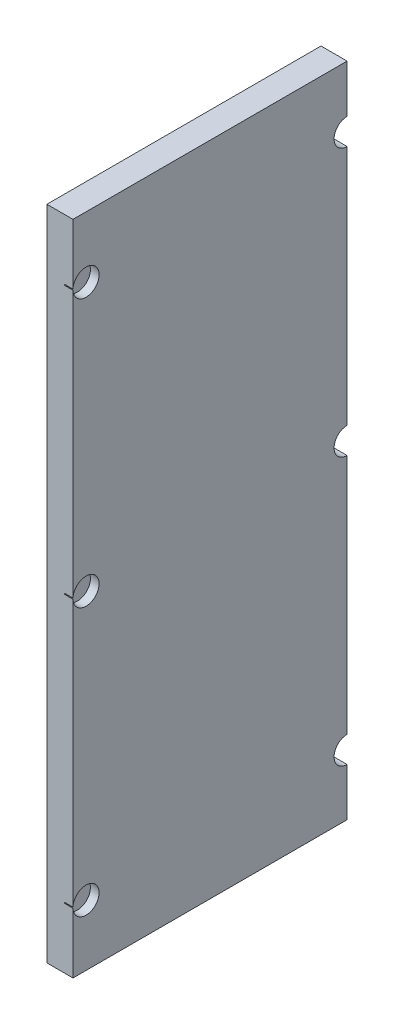
ISO-10303-21;
HEADER;
FILE_DESCRIPTION(('STEP AP214'),'2;1');
FILE_NAME('part.step','',(''),(''),'','','');
FILE_SCHEMA(('AUTOMOTIVE_DESIGN { 1 0 10303 214 1 1 1 1 }'));
ENDSEC;
DATA;
#1=APPLICATION_CONTEXT('core data for automotive mechanical design processes');
#2=APPLICATION_PROTOCOL_DEFINITION('international standard','automotive_design',2000,#1);
#3=PRODUCT_CONTEXT('',#1,'mechanical');
#4=PRODUCT('Part','Part','',(#3));
#5=PRODUCT_RELATED_PRODUCT_CATEGORY('part','',(#4));
#6=PRODUCT_DEFINITION_FORMATION('','',#4);
#7=PRODUCT_DEFINITION_CONTEXT('part definition',#1,'design');
#8=PRODUCT_DEFINITION('design','',#6,#7);
#9=PRODUCT_DEFINITION_SHAPE('','',#8);
#10=(LENGTH_UNIT() NAMED_UNIT(*) SI_UNIT(.MILLI.,.METRE.));
#11=(NAMED_UNIT(*) PLANE_ANGLE_UNIT() SI_UNIT($,.RADIAN.));
#12=(NAMED_UNIT(*) SI_UNIT($,.STERADIAN.) SOLID_ANGLE_UNIT());
#13=UNCERTAINTY_MEASURE_WITH_UNIT(LENGTH_MEASURE(1.E-05),#10,'distance_accuracy_value','');
#14=(GEOMETRIC_REPRESENTATION_CONTEXT(3) GLOBAL_UNCERTAINTY_ASSIGNED_CONTEXT((#13)) GLOBAL_UNIT_ASSIGNED_CONTEXT((#10,
#11,#12)) REPRESENTATION_CONTEXT('',''));
#15=CARTESIAN_POINT('',(0.,0.,0.));
#16=DIRECTION('',(0.,0.,1.));
#17=DIRECTION('',(1.,0.,0.));
#18=AXIS2_PLACEMENT_3D('',#15,#16,#17);
#19=CARTESIAN_POINT('',(0.,0.,0.));
#20=DIRECTION('',(0.,0.,-1.));
#21=DIRECTION('',(-1.,0.,0.));
#22=AXIS2_PLACEMENT_3D('',#19,#20,#21);
#23=PLANE('',#22);
#24=DIRECTION('',(-1.,0.,0.));
#25=VECTOR('',#24,1.);
#26=CARTESIAN_POINT('',(4.,5.5,0.));
#27=LINE('',#26,#25);
#28=CARTESIAN_POINT('',(3.,5.5,0.));
#29=VERTEX_POINT('',#28);
#30=CARTESIAN_POINT('',(0.,5.5,0.));
#31=VERTEX_POINT('',#30);
#32=EDGE_CURVE('E11',#29,#31,#27,.T.);
#33=ORIENTED_EDGE('',*,*,#32,.F.);
#34=DIRECTION('',(0.,1.,0.));
#35=VECTOR('',#34,1.);
#36=CARTESIAN_POINT('',(3.,0.,0.));
#37=LINE('',#36,#35);
#38=CARTESIAN_POINT('',(3.,0.,0.));
#39=VERTEX_POINT('',#38);
#40=EDGE_CURVE('E207',#39,#29,#37,.T.);
#41=ORIENTED_EDGE('',*,*,#40,.F.);
#42=DIRECTION('',(1.,0.,0.));
#43=VECTOR('',#42,1.);
#44=CARTESIAN_POINT('',(0.,0.,0.));
#45=LINE('',#44,#43);
#46=CARTESIAN_POINT('',(0.,0.,0.));
#47=VERTEX_POINT('',#46);
#48=EDGE_CURVE('E167',#47,#39,#45,.T.);
#49=ORIENTED_EDGE('',*,*,#48,.F.);
#50=DIRECTION('',(0.,-1.,0.));
#51=VECTOR('',#50,1.);
#52=CARTESIAN_POINT('',(0.,0.,0.));
#53=LINE('',#52,#51);
#54=EDGE_CURVE('E161',#31,#47,#53,.T.);
#55=ORIENTED_EDGE('',*,*,#54,.F.);
#56=EDGE_LOOP('',(#33,#41,#49,#55));
#57=FACE_BOUND('',#56,.T.);
#58=ADVANCED_FACE('F41',(#57),#23,.T.);
#59=DIRECTION('',(-1.,0.,0.));
#60=VECTOR('',#59,1.);
#61=CARTESIAN_POINT('',(4.,8.5,0.));
#62=LINE('',#61,#60);
#63=CARTESIAN_POINT('',(0.,8.5,0.));
#64=VERTEX_POINT('',#63);
#65=CARTESIAN_POINT('',(3.,8.5,0.));
#66=VERTEX_POINT('',#65);
#67=EDGE_CURVE('E49',#64,#66,#62,.F.);
#68=ORIENTED_EDGE('',*,*,#67,.F.);
#69=CARTESIAN_POINT('',(0.,36.25,0.));
#70=VERTEX_POINT('',#69);
#71=EDGE_CURVE('E164',#70,#64,#53,.T.);
#72=ORIENTED_EDGE('',*,*,#71,.F.);
#73=DIRECTION('',(-1.,0.,0.));
#74=VECTOR('',#73,1.);
#75=CARTESIAN_POINT('',(4.,36.25,0.));
#76=LINE('',#75,#74);
#77=CARTESIAN_POINT('',(3.,36.25,0.));
#78=VERTEX_POINT('',#77);
#79=EDGE_CURVE('E194',#78,#70,#76,.T.);
#80=ORIENTED_EDGE('',*,*,#79,.F.);
#81=EDGE_CURVE('E205',#66,#78,#37,.T.);
#82=ORIENTED_EDGE('',*,*,#81,.F.);
#83=EDGE_LOOP('',(#68,#72,#80,#82));
#84=FACE_BOUND('',#83,.T.);
#85=ADVANCED_FACE('F212',(#84),#23,.T.);
#86=DIRECTION('',(-1.,0.,0.));
#87=VECTOR('',#86,1.);
#88=CARTESIAN_POINT('',(4.,39.25,0.));
#89=LINE('',#88,#87);
#90=CARTESIAN_POINT('',(0.,39.25,0.));
#91=VERTEX_POINT('',#90);
#92=CARTESIAN_POINT('',(3.,39.25,0.));
#93=VERTEX_POINT('',#92);
#94=EDGE_CURVE('E191',#91,#93,#89,.F.);
#95=ORIENTED_EDGE('',*,*,#94,.F.);
#96=CARTESIAN_POINT('',(0.,67.,0.));
#97=VERTEX_POINT('',#96);
#98=EDGE_CURVE('E172',#97,#91,#53,.T.);
#99=ORIENTED_EDGE('',*,*,#98,.F.);
#100=DIRECTION('',(-1.,0.,0.));
#101=VECTOR('',#100,1.);
#102=CARTESIAN_POINT('',(4.,67.,0.));
#103=LINE('',#102,#101);
#104=CARTESIAN_POINT('',(3.,67.,0.));
#105=VERTEX_POINT('',#104);
#106=EDGE_CURVE('E189',#105,#97,#103,.T.);
#107=ORIENTED_EDGE('',*,*,#106,.F.);
#108=EDGE_CURVE('E192',#93,#105,#37,.T.);
#109=ORIENTED_EDGE('',*,*,#108,.F.);
#110=EDGE_LOOP('',(#95,#99,#107,#109));
#111=FACE_BOUND('',#110,.T.);
#112=ADVANCED_FACE('F187',(#111),#23,.T.);
#113=CARTESIAN_POINT('',(0.,0.,31.5));
#114=DIRECTION('',(1.,0.,0.));
#115=DIRECTION('',(0.,0.,-1.));
#116=AXIS2_PLACEMENT_3D('',#113,#114,#115);
#117=PLANE('',#116);
#118=ORIENTED_EDGE('',*,*,#71,.T.);
#119=CARTESIAN_POINT('',(0.,7.,0.));
#120=DIRECTION('',(-1.,0.,0.));
#121=DIRECTION('',(0.,0.,1.));
#122=AXIS2_PLACEMENT_3D('',#119,#120,#121);
#123=CIRCLE('',#122,1.5);
#124=EDGE_CURVE('E55',#31,#64,#123,.T.);
#125=ORIENTED_EDGE('',*,*,#124,.F.);
#126=ORIENTED_EDGE('',*,*,#54,.T.);
#127=DIRECTION('',(0.,0.,-1.));
#128=VECTOR('',#127,1.);
#129=CARTESIAN_POINT('',(0.,0.,31.5));
#130=LINE('',#129,#128);
#131=CARTESIAN_POINT('',(0.,0.,31.5));
#132=VERTEX_POINT('',#131);
#133=EDGE_CURVE('E218',#132,#47,#130,.T.);
#134=ORIENTED_EDGE('',*,*,#133,.F.);
#135=DIRECTION('',(0.,-1.,0.));
#136=VECTOR('',#135,1.);
#137=CARTESIAN_POINT('',(0.,0.,31.5));
#138=LINE('',#137,#136);
#139=CARTESIAN_POINT('',(0.,75.5,31.5));
#140=VERTEX_POINT('',#139);
#141=EDGE_CURVE('E214',#140,#132,#138,.T.);
#142=ORIENTED_EDGE('',*,*,#141,.F.);
#143=DIRECTION('',(0.,0.,-1.));
#144=VECTOR('',#143,1.);
#145=CARTESIAN_POINT('',(0.,75.5,31.5));
#146=LINE('',#145,#144);
#147=CARTESIAN_POINT('',(0.,75.5,0.));
#148=VERTEX_POINT('',#147);
#149=EDGE_CURVE('E174',#140,#148,#146,.T.);
#150=ORIENTED_EDGE('',*,*,#149,.T.);
#151=CARTESIAN_POINT('',(0.,70.,0.));
#152=VERTEX_POINT('',#151);
#153=EDGE_CURVE('E171',#148,#152,#53,.T.);
#154=ORIENTED_EDGE('',*,*,#153,.T.);
#155=CARTESIAN_POINT('',(0.,68.5,0.));
#156=DIRECTION('',(-1.,0.,0.));
#157=DIRECTION('',(0.,0.,1.));
#158=AXIS2_PLACEMENT_3D('',#155,#156,#157);
#159=CIRCLE('',#158,1.5);
#160=EDGE_CURVE('E184',#97,#152,#159,.T.);
#161=ORIENTED_EDGE('',*,*,#160,.F.);
#162=ORIENTED_EDGE('',*,*,#98,.T.);
#163=CARTESIAN_POINT('',(0.,37.75,0.));
#164=DIRECTION('',(-1.,0.,0.));
#165=DIRECTION('',(0.,0.,1.));
#166=AXIS2_PLACEMENT_3D('',#163,#164,#165);
#167=CIRCLE('',#166,1.5);
#168=EDGE_CURVE('E63',#70,#91,#167,.T.);
#169=ORIENTED_EDGE('',*,*,#168,.F.);
#170=EDGE_LOOP('',(#118,#125,#126,#134,#142,#150,#154,#161,#162,#169));
#171=FACE_BOUND('',#170,.T.);
#172=ADVANCED_FACE('F43',(#171),#117,.F.);
#173=CARTESIAN_POINT('',(0.,0.,31.5));
#174=DIRECTION('',(0.,1.,0.));
#175=DIRECTION('',(0.,0.,1.));
#176=AXIS2_PLACEMENT_3D('',#173,#174,#175);
#177=PLANE('',#176);
#178=ORIENTED_EDGE('',*,*,#48,.T.);
#179=DIRECTION('',(0.,0.,-1.));
#180=VECTOR('',#179,1.);
#181=CARTESIAN_POINT('',(3.,0.,31.5));
#182=LINE('',#181,#180);
#183=CARTESIAN_POINT('',(3.,0.,31.5));
#184=VERTEX_POINT('',#183);
#185=EDGE_CURVE('E216',#184,#39,#182,.T.);
#186=ORIENTED_EDGE('',*,*,#185,.F.);
#187=DIRECTION('',(1.,0.,0.));
#188=VECTOR('',#187,1.);
#189=CARTESIAN_POINT('',(0.,0.,31.5));
#190=LINE('',#189,#188);
#191=EDGE_CURVE('E242',#132,#184,#190,.T.);
#192=ORIENTED_EDGE('',*,*,#191,.F.);
#193=ORIENTED_EDGE('',*,*,#133,.T.);
#194=EDGE_LOOP('',(#178,#186,#192,#193));
#195=FACE_BOUND('',#194,.T.);
#196=ADVANCED_FACE('F310',(#195),#177,.F.);
#197=CARTESIAN_POINT('',(3.,0.,31.5));
#198=DIRECTION('',(-1.,0.,0.));
#199=DIRECTION('',(0.,0.,1.));
#200=AXIS2_PLACEMENT_3D('',#197,#198,#199);
#201=PLANE('',#200);
#202=ORIENTED_EDGE('',*,*,#40,.T.);
#203=CARTESIAN_POINT('',(3.,7.,0.));
#204=DIRECTION('',(-1.,0.,0.));
#205=DIRECTION('',(0.,0.,1.));
#206=AXIS2_PLACEMENT_3D('',#203,#204,#205);
#207=CIRCLE('',#206,1.5);
#208=EDGE_CURVE('E153',#29,#66,#207,.T.);
#209=ORIENTED_EDGE('',*,*,#208,.T.);
#210=ORIENTED_EDGE('',*,*,#81,.T.);
#211=CARTESIAN_POINT('',(3.,37.75,0.));
#212=DIRECTION('',(-1.,0.,0.));
#213=DIRECTION('',(0.,0.,1.));
#214=AXIS2_PLACEMENT_3D('',#211,#212,#213);
#215=CIRCLE('',#214,1.5);
#216=EDGE_CURVE('E209',#78,#93,#215,.T.);
#217=ORIENTED_EDGE('',*,*,#216,.T.);
#218=ORIENTED_EDGE('',*,*,#108,.T.);
#219=CARTESIAN_POINT('',(3.,68.5,0.));
#220=DIRECTION('',(-1.,0.,0.));
#221=DIRECTION('',(0.,0.,1.));
#222=AXIS2_PLACEMENT_3D('',#219,#220,#221);
#223=CIRCLE('',#222,1.5);
#224=CARTESIAN_POINT('',(3.,70.,0.));
#225=VERTEX_POINT('',#224);
#226=EDGE_CURVE('E165',#105,#225,#223,.T.);
#227=ORIENTED_EDGE('',*,*,#226,.T.);
#228=CARTESIAN_POINT('',(3.,75.5,0.));
#229=VERTEX_POINT('',#228);
#230=EDGE_CURVE('E181',#225,#229,#37,.T.);
#231=ORIENTED_EDGE('',*,*,#230,.T.);
#232=DIRECTION('',(0.,0.,-1.));
#233=VECTOR('',#232,1.);
#234=CARTESIAN_POINT('',(3.,75.5,31.5));
#235=LINE('',#234,#233);
#236=CARTESIAN_POINT('',(3.,75.5,31.5));
#237=VERTEX_POINT('',#236);
#238=EDGE_CURVE('E169',#237,#229,#235,.T.);
#239=ORIENTED_EDGE('',*,*,#238,.F.);
#240=DIRECTION('',(0.,1.,0.));
#241=VECTOR('',#240,1.);
#242=CARTESIAN_POINT('',(3.,0.,31.5));
#243=LINE('',#242,#241);
#244=CARTESIAN_POINT('',(3.,68.5547631262804,31.5));
#245=VERTEX_POINT('',#244);
#246=EDGE_CURVE('E238',#245,#237,#243,.T.);
#247=ORIENTED_EDGE('',*,*,#246,.F.);
#248=CARTESIAN_POINT('',(3.,68.5,30.001));
#249=DIRECTION('',(1.,0.,0.));
#250=DIRECTION('',(0.,0.,-1.));
#251=AXIS2_PLACEMENT_3D('',#248,#249,#250);
#252=CIRCLE('',#251,1.5);
#253=CARTESIAN_POINT('',(3.,68.4452368737196,31.5));
#254=VERTEX_POINT('',#253);
#255=EDGE_CURVE('E488',#254,#245,#252,.T.);
#256=ORIENTED_EDGE('',*,*,#255,.F.);
#257=CARTESIAN_POINT('',(3.,37.8047631262804,31.5));
#258=VERTEX_POINT('',#257);
#259=EDGE_CURVE('E234',#258,#254,#243,.T.);
#260=ORIENTED_EDGE('',*,*,#259,.F.);
#261=CARTESIAN_POINT('',(3.,37.75,30.001));
#262=DIRECTION('',(1.,0.,0.));
#263=DIRECTION('',(0.,0.,-1.));
#264=AXIS2_PLACEMENT_3D('',#261,#262,#263);
#265=CIRCLE('',#264,1.5);
#266=CARTESIAN_POINT('',(3.,37.6952368737196,31.5));
#267=VERTEX_POINT('',#266);
#268=EDGE_CURVE('E485',#267,#258,#265,.T.);
#269=ORIENTED_EDGE('',*,*,#268,.F.);
#270=CARTESIAN_POINT('',(3.,7.05476312628038,31.5));
#271=VERTEX_POINT('',#270);
#272=EDGE_CURVE('E237',#271,#267,#243,.T.);
#273=ORIENTED_EDGE('',*,*,#272,.F.);
#274=CARTESIAN_POINT('',(3.,7.,30.001));
#275=DIRECTION('',(1.,0.,0.));
#276=DIRECTION('',(0.,0.,-1.));
#277=AXIS2_PLACEMENT_3D('',#274,#275,#276);
#278=CIRCLE('',#277,1.5);
#279=CARTESIAN_POINT('',(3.,6.94523687371962,31.5));
#280=VERTEX_POINT('',#279);
#281=EDGE_CURVE('E293',#280,#271,#278,.T.);
#282=ORIENTED_EDGE('',*,*,#281,.F.);
#283=EDGE_CURVE('E219',#184,#280,#243,.T.);
#284=ORIENTED_EDGE('',*,*,#283,.F.);
#285=ORIENTED_EDGE('',*,*,#185,.T.);
#286=EDGE_LOOP('',(#202,#209,#210,#217,#218,#227,#231,#239,#247,#256,#260,#269,#273,#282,#284,#285));
#287=FACE_BOUND('',#286,.T.);
#288=ADVANCED_FACE('F204',(#287),#201,.F.);
#289=CARTESIAN_POINT('',(0.,0.,31.5));
#290=DIRECTION('',(0.,0.,-1.));
#291=DIRECTION('',(-1.,0.,0.));
#292=AXIS2_PLACEMENT_3D('',#289,#290,#291);
#293=PLANE('',#292);
#294=DIRECTION('',(0.,1.,0.));
#295=VECTOR('',#294,1.);
#296=CARTESIAN_POINT('',(2.,7.,31.5));
#297=LINE('',#296,#295);
#298=CARTESIAN_POINT('',(2.,7.05476312628038,31.5));
#299=VERTEX_POINT('',#298);
#300=CARTESIAN_POINT('',(2.,6.94523687371962,31.5));
#301=VERTEX_POINT('',#300);
#302=EDGE_CURVE('E257',#299,#301,#297,.F.);
#303=ORIENTED_EDGE('',*,*,#302,.F.);
#304=DIRECTION('',(1.,0.,0.));
#305=VECTOR('',#304,1.);
#306=CARTESIAN_POINT('',(2.,7.05476312628038,31.5));
#307=LINE('',#306,#305);
#308=EDGE_CURVE('E263',#299,#271,#307,.T.);
#309=ORIENTED_EDGE('',*,*,#308,.T.);
#310=ORIENTED_EDGE('',*,*,#272,.T.);
#311=DIRECTION('',(1.,0.,0.));
#312=VECTOR('',#311,1.);
#313=CARTESIAN_POINT('',(2.,37.6952368737196,31.5));
#314=LINE('',#313,#312);
#315=CARTESIAN_POINT('',(2.,37.6952368737196,31.5));
#316=VERTEX_POINT('',#315);
#317=EDGE_CURVE('E252',#267,#316,#314,.F.);
#318=ORIENTED_EDGE('',*,*,#317,.T.);
#319=DIRECTION('',(0.,1.,0.));
#320=VECTOR('',#319,1.);
#321=CARTESIAN_POINT('',(2.,37.75,31.5));
#322=LINE('',#321,#320);
#323=CARTESIAN_POINT('',(2.,37.8047631262804,31.5));
#324=VERTEX_POINT('',#323);
#325=EDGE_CURVE('E270',#324,#316,#322,.F.);
#326=ORIENTED_EDGE('',*,*,#325,.F.);
#327=DIRECTION('',(1.,0.,0.));
#328=VECTOR('',#327,1.);
#329=CARTESIAN_POINT('',(2.,37.8047631262804,31.5));
#330=LINE('',#329,#328);
#331=EDGE_CURVE('E253',#324,#258,#330,.T.);
#332=ORIENTED_EDGE('',*,*,#331,.T.);
#333=ORIENTED_EDGE('',*,*,#259,.T.);
#334=DIRECTION('',(1.,0.,0.));
#335=VECTOR('',#334,1.);
#336=CARTESIAN_POINT('',(2.,68.4452368737196,31.5));
#337=LINE('',#336,#335);
#338=CARTESIAN_POINT('',(2.,68.4452368737196,31.5));
#339=VERTEX_POINT('',#338);
#340=EDGE_CURVE('E227',#254,#339,#337,.F.);
#341=ORIENTED_EDGE('',*,*,#340,.T.);
#342=DIRECTION('',(0.,1.,0.));
#343=VECTOR('',#342,1.);
#344=CARTESIAN_POINT('',(2.,68.5,31.5));
#345=LINE('',#344,#343);
#346=CARTESIAN_POINT('',(2.,68.5547631262804,31.5));
#347=VERTEX_POINT('',#346);
#348=EDGE_CURVE('E221',#347,#339,#345,.F.);
#349=ORIENTED_EDGE('',*,*,#348,.F.);
#350=DIRECTION('',(1.,0.,0.));
#351=VECTOR('',#350,1.);
#352=CARTESIAN_POINT('',(2.,68.5547631262804,31.5));
#353=LINE('',#352,#351);
#354=EDGE_CURVE('E231',#347,#245,#353,.T.);
#355=ORIENTED_EDGE('',*,*,#354,.T.);
#356=ORIENTED_EDGE('',*,*,#246,.T.);
#357=DIRECTION('',(-1.,0.,0.));
#358=VECTOR('',#357,1.);
#359=CARTESIAN_POINT('',(0.,75.5,31.5));
#360=LINE('',#359,#358);
#361=EDGE_CURVE('E288',#237,#140,#360,.T.);
#362=ORIENTED_EDGE('',*,*,#361,.T.);
#363=ORIENTED_EDGE('',*,*,#141,.T.);
#364=ORIENTED_EDGE('',*,*,#191,.T.);
#365=ORIENTED_EDGE('',*,*,#283,.T.);
#366=DIRECTION('',(1.,0.,0.));
#367=VECTOR('',#366,1.);
#368=CARTESIAN_POINT('',(2.,6.94523687371962,31.5));
#369=LINE('',#368,#367);
#370=EDGE_CURVE('E258',#280,#301,#369,.F.);
#371=ORIENTED_EDGE('',*,*,#370,.T.);
#372=EDGE_LOOP('',(#303,#309,#310,#318,#326,#332,#333,#341,#349,#355,#356,#362,#363,#364,#365,#371));
#373=FACE_BOUND('',#372,.T.);
#374=ADVANCED_FACE('F303',(#373),#293,.F.);
#375=DIRECTION('',(-1.,0.,0.));
#376=VECTOR('',#375,1.);
#377=CARTESIAN_POINT('',(4.,70.,0.));
#378=LINE('',#377,#376);
#379=EDGE_CURVE('E197',#152,#225,#378,.F.);
#380=ORIENTED_EDGE('',*,*,#379,.F.);
#381=ORIENTED_EDGE('',*,*,#153,.F.);
#382=DIRECTION('',(-1.,0.,0.));
#383=VECTOR('',#382,1.);
#384=CARTESIAN_POINT('',(0.,75.5,0.));
#385=LINE('',#384,#383);
#386=EDGE_CURVE('E285',#229,#148,#385,.T.);
#387=ORIENTED_EDGE('',*,*,#386,.F.);
#388=ORIENTED_EDGE('',*,*,#230,.F.);
#389=EDGE_LOOP('',(#380,#381,#387,#388));
#390=FACE_BOUND('',#389,.T.);
#391=ADVANCED_FACE('F283',(#390),#23,.T.);
#392=CARTESIAN_POINT('',(0.,75.5,31.5));
#393=DIRECTION('',(0.,-1.,0.));
#394=DIRECTION('',(0.,0.,-1.));
#395=AXIS2_PLACEMENT_3D('',#392,#393,#394);
#396=PLANE('',#395);
#397=ORIENTED_EDGE('',*,*,#386,.T.);
#398=ORIENTED_EDGE('',*,*,#149,.F.);
#399=ORIENTED_EDGE('',*,*,#361,.F.);
#400=ORIENTED_EDGE('',*,*,#238,.T.);
#401=EDGE_LOOP('',(#397,#398,#399,#400));
#402=FACE_BOUND('',#401,.T.);
#403=ADVANCED_FACE('F308',(#402),#396,.F.);
#404=CARTESIAN_POINT('',(2.,68.5,30.001));
#405=DIRECTION('',(1.,0.,0.));
#406=DIRECTION('',(0.,0.,-1.));
#407=AXIS2_PLACEMENT_3D('',#404,#405,#406);
#408=CYLINDRICAL_SURFACE('',#407,1.5);
#409=CARTESIAN_POINT('',(2.,68.5,30.001));
#410=DIRECTION('',(1.,0.,0.));
#411=DIRECTION('',(0.,0.,-1.));
#412=AXIS2_PLACEMENT_3D('',#409,#410,#411);
#413=CIRCLE('',#412,1.5);
#414=EDGE_CURVE('E208',#339,#347,#413,.T.);
#415=ORIENTED_EDGE('',*,*,#414,.F.);
#416=ORIENTED_EDGE('',*,*,#340,.F.);
#417=ORIENTED_EDGE('',*,*,#255,.T.);
#418=ORIENTED_EDGE('',*,*,#354,.F.);
#419=EDGE_LOOP('',(#415,#416,#417,#418));
#420=FACE_BOUND('',#419,.T.);
#421=ADVANCED_FACE('F341',(#420),#408,.F.);
#422=CARTESIAN_POINT('',(2.,68.5,30.001));
#423=DIRECTION('',(1.,0.,0.));
#424=DIRECTION('',(0.,0.,-1.));
#425=AXIS2_PLACEMENT_3D('',#422,#423,#424);
#426=PLANE('',#425);
#427=ORIENTED_EDGE('',*,*,#348,.T.);
#428=ORIENTED_EDGE('',*,*,#414,.T.);
#429=EDGE_LOOP('',(#427,#428));
#430=FACE_BOUND('',#429,.T.);
#431=ADVANCED_FACE('F390',(#430),#426,.T.);
#432=CARTESIAN_POINT('',(2.,37.75,30.001));
#433=DIRECTION('',(1.,0.,0.));
#434=DIRECTION('',(0.,0.,-1.));
#435=AXIS2_PLACEMENT_3D('',#432,#433,#434);
#436=CYLINDRICAL_SURFACE('',#435,1.5);
#437=CARTESIAN_POINT('',(2.,37.75,30.001));
#438=DIRECTION('',(1.,0.,0.));
#439=DIRECTION('',(0.,0.,-1.));
#440=AXIS2_PLACEMENT_3D('',#437,#438,#439);
#441=CIRCLE('',#440,1.5);
#442=EDGE_CURVE('E487',#316,#324,#441,.T.);
#443=ORIENTED_EDGE('',*,*,#442,.F.);
#444=ORIENTED_EDGE('',*,*,#317,.F.);
#445=ORIENTED_EDGE('',*,*,#268,.T.);
#446=ORIENTED_EDGE('',*,*,#331,.F.);
#447=EDGE_LOOP('',(#443,#444,#445,#446));
#448=FACE_BOUND('',#447,.T.);
#449=ADVANCED_FACE('F400',(#448),#436,.F.);
#450=CARTESIAN_POINT('',(2.,37.75,30.001));
#451=DIRECTION('',(1.,0.,0.));
#452=DIRECTION('',(0.,0.,-1.));
#453=AXIS2_PLACEMENT_3D('',#450,#451,#452);
#454=PLANE('',#453);
#455=ORIENTED_EDGE('',*,*,#325,.T.);
#456=ORIENTED_EDGE('',*,*,#442,.T.);
#457=EDGE_LOOP('',(#455,#456));
#458=FACE_BOUND('',#457,.T.);
#459=ADVANCED_FACE('F328',(#458),#454,.T.);
#460=CARTESIAN_POINT('',(2.,7.,30.001));
#461=DIRECTION('',(1.,0.,0.));
#462=DIRECTION('',(0.,0.,-1.));
#463=AXIS2_PLACEMENT_3D('',#460,#461,#462);
#464=CYLINDRICAL_SURFACE('',#463,1.5);
#465=CARTESIAN_POINT('',(2.,7.,30.001));
#466=DIRECTION('',(1.,0.,0.));
#467=DIRECTION('',(0.,0.,-1.));
#468=AXIS2_PLACEMENT_3D('',#465,#466,#467);
#469=CIRCLE('',#468,1.5);
#470=EDGE_CURVE('E289',#301,#299,#469,.T.);
#471=ORIENTED_EDGE('',*,*,#470,.F.);
#472=ORIENTED_EDGE('',*,*,#370,.F.);
#473=ORIENTED_EDGE('',*,*,#281,.T.);
#474=ORIENTED_EDGE('',*,*,#308,.F.);
#475=EDGE_LOOP('',(#471,#472,#473,#474));
#476=FACE_BOUND('',#475,.T.);
#477=ADVANCED_FACE('F315',(#476),#464,.F.);
#478=CARTESIAN_POINT('',(2.,7.,30.001));
#479=DIRECTION('',(1.,0.,0.));
#480=DIRECTION('',(0.,0.,-1.));
#481=AXIS2_PLACEMENT_3D('',#478,#479,#480);
#482=PLANE('',#481);
#483=ORIENTED_EDGE('',*,*,#302,.T.);
#484=ORIENTED_EDGE('',*,*,#470,.T.);
#485=EDGE_LOOP('',(#483,#484));
#486=FACE_BOUND('',#485,.T.);
#487=ADVANCED_FACE('F318',(#486),#482,.T.);
#488=CARTESIAN_POINT('',(4.,68.5,0.));
#489=DIRECTION('',(-1.,0.,0.));
#490=DIRECTION('',(0.,0.,1.));
#491=AXIS2_PLACEMENT_3D('',#488,#489,#490);
#492=CYLINDRICAL_SURFACE('',#491,1.5);
#493=ORIENTED_EDGE('',*,*,#106,.T.);
#494=ORIENTED_EDGE('',*,*,#160,.T.);
#495=ORIENTED_EDGE('',*,*,#379,.T.);
#496=ORIENTED_EDGE('',*,*,#226,.F.);
#497=EDGE_LOOP('',(#493,#494,#495,#496));
#498=FACE_BOUND('',#497,.T.);
#499=ADVANCED_FACE('F277',(#498),#492,.F.);
#500=CARTESIAN_POINT('',(4.,37.75,0.));
#501=DIRECTION('',(-1.,0.,0.));
#502=DIRECTION('',(0.,0.,1.));
#503=AXIS2_PLACEMENT_3D('',#500,#501,#502);
#504=CYLINDRICAL_SURFACE('',#503,1.5);
#505=ORIENTED_EDGE('',*,*,#79,.T.);
#506=ORIENTED_EDGE('',*,*,#168,.T.);
#507=ORIENTED_EDGE('',*,*,#94,.T.);
#508=ORIENTED_EDGE('',*,*,#216,.F.);
#509=EDGE_LOOP('',(#505,#506,#507,#508));
#510=FACE_BOUND('',#509,.T.);
#511=ADVANCED_FACE('F326',(#510),#504,.F.);
#512=CARTESIAN_POINT('',(4.,7.,0.));
#513=DIRECTION('',(-1.,0.,0.));
#514=DIRECTION('',(0.,0.,1.));
#515=AXIS2_PLACEMENT_3D('',#512,#513,#514);
#516=CYLINDRICAL_SURFACE('',#515,1.5);
#517=ORIENTED_EDGE('',*,*,#32,.T.);
#518=ORIENTED_EDGE('',*,*,#124,.T.);
#519=ORIENTED_EDGE('',*,*,#67,.T.);
#520=ORIENTED_EDGE('',*,*,#208,.F.);
#521=EDGE_LOOP('',(#517,#518,#519,#520));
#522=FACE_BOUND('',#521,.T.);
#523=ADVANCED_FACE('F151',(#522),#516,.F.);
#524=CLOSED_SHELL('',(#58,#85,#112,#172,#196,#288,#374,#391,#403,#421,#431,#449,#459,#477,#487,
#499,#511,#523));
#525=MANIFOLD_SOLID_BREP('B2',#524);
#526=ADVANCED_BREP_SHAPE_REPRESENTATION('',(#18,#525),#14);
#527=SHAPE_DEFINITION_REPRESENTATION(#9,#526);
ENDSEC;
END-ISO-10303-21;
